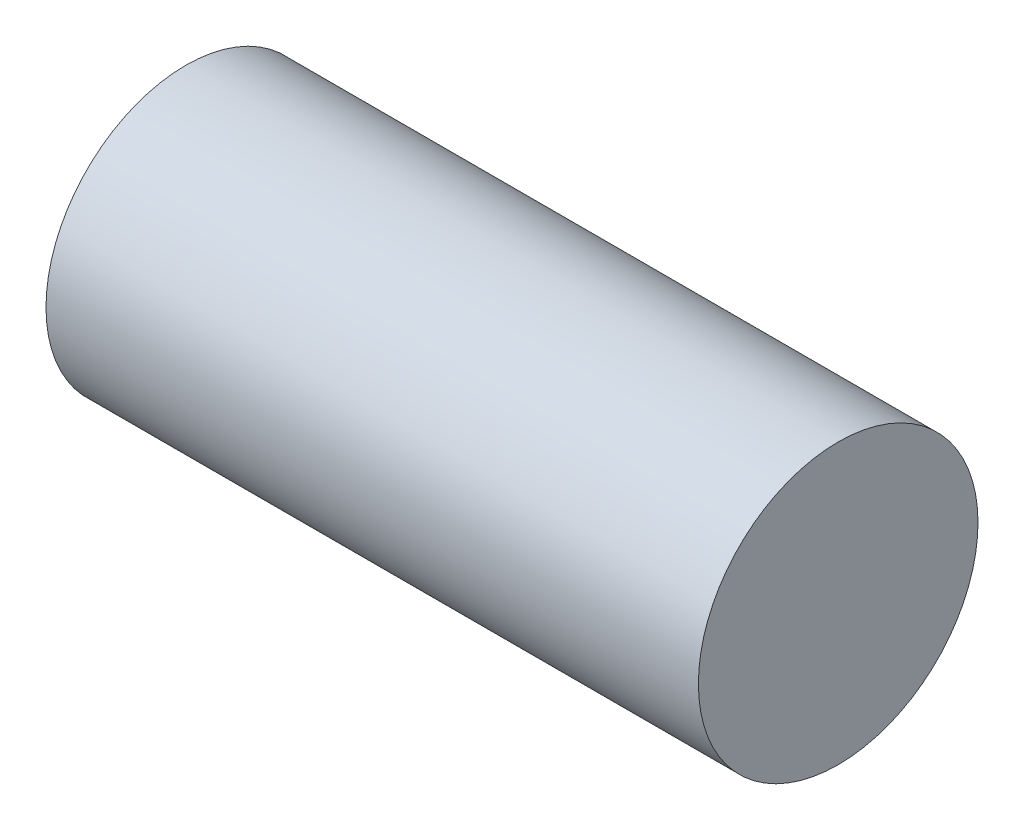
ISO-10303-21;
HEADER;
FILE_DESCRIPTION(('STEP AP214'),'2;1');
FILE_NAME('part.step','',(''),(''),'','','');
FILE_SCHEMA(('AUTOMOTIVE_DESIGN { 1 0 10303 214 1 1 1 1 }'));
ENDSEC;
DATA;
#1=APPLICATION_CONTEXT('core data for automotive mechanical design processes');
#2=APPLICATION_PROTOCOL_DEFINITION('international standard','automotive_design',2000,#1);
#3=PRODUCT_CONTEXT('',#1,'mechanical');
#4=PRODUCT('Part','Part','',(#3));
#5=PRODUCT_RELATED_PRODUCT_CATEGORY('part','',(#4));
#6=PRODUCT_DEFINITION_FORMATION('','',#4);
#7=PRODUCT_DEFINITION_CONTEXT('part definition',#1,'design');
#8=PRODUCT_DEFINITION('design','',#6,#7);
#9=PRODUCT_DEFINITION_SHAPE('','',#8);
#10=(LENGTH_UNIT() NAMED_UNIT(*) SI_UNIT(.MILLI.,.METRE.));
#11=(NAMED_UNIT(*) PLANE_ANGLE_UNIT() SI_UNIT($,.RADIAN.));
#12=(NAMED_UNIT(*) SI_UNIT($,.STERADIAN.) SOLID_ANGLE_UNIT());
#13=UNCERTAINTY_MEASURE_WITH_UNIT(LENGTH_MEASURE(1.E-05),#10,'distance_accuracy_value','');
#14=(GEOMETRIC_REPRESENTATION_CONTEXT(3) GLOBAL_UNCERTAINTY_ASSIGNED_CONTEXT((#13)) GLOBAL_UNIT_ASSIGNED_CONTEXT((#10,
#11,#12)) REPRESENTATION_CONTEXT('',''));
#15=CARTESIAN_POINT('',(0.,0.,0.));
#16=DIRECTION('',(0.,0.,1.));
#17=DIRECTION('',(1.,0.,0.));
#18=AXIS2_PLACEMENT_3D('',#15,#16,#17);
#19=CARTESIAN_POINT('',(341.376,0.,0.));
#20=DIRECTION('',(-1.,0.,0.));
#21=DIRECTION('',(0.,0.,1.));
#22=AXIS2_PLACEMENT_3D('',#19,#20,#21);
#23=CYLINDRICAL_SURFACE('',#22,108.204);
#24=CARTESIAN_POINT('',(341.376,0.,0.));
#25=DIRECTION('',(1.,0.,0.));
#26=DIRECTION('',(0.,0.,-1.));
#27=AXIS2_PLACEMENT_3D('',#24,#25,#26);
#28=CIRCLE('',#27,108.204);
#29=CARTESIAN_POINT('',(341.376,0.,-108.204));
#30=VERTEX_POINT('',#29);
#31=EDGE_CURVE('E10',#30,#30,#28,.T.);
#32=ORIENTED_EDGE('',*,*,#31,.F.);
#33=EDGE_LOOP('',(#32));
#34=FACE_BOUND('',#33,.T.);
#35=CARTESIAN_POINT('',(-163.576,0.,0.));
#36=DIRECTION('',(1.,0.,0.));
#37=DIRECTION('',(0.,0.,-1.));
#38=AXIS2_PLACEMENT_3D('',#35,#36,#37);
#39=CIRCLE('',#38,108.204);
#40=CARTESIAN_POINT('',(-163.576,0.,-108.204));
#41=VERTEX_POINT('',#40);
#42=EDGE_CURVE('E40',#41,#41,#39,.T.);
#43=ORIENTED_EDGE('',*,*,#42,.T.);
#44=EDGE_LOOP('',(#43));
#45=FACE_BOUND('',#44,.T.);
#46=ADVANCED_FACE('F37',(#34,#45),#23,.T.);
#47=CARTESIAN_POINT('',(341.376,0.,0.));
#48=DIRECTION('',(1.,0.,0.));
#49=DIRECTION('',(0.,0.,-1.));
#50=AXIS2_PLACEMENT_3D('',#47,#48,#49);
#51=PLANE('',#50);
#52=ORIENTED_EDGE('',*,*,#31,.T.);
#53=EDGE_LOOP('',(#52));
#54=FACE_BOUND('',#53,.T.);
#55=ADVANCED_FACE('F52',(#54),#51,.T.);
#56=CARTESIAN_POINT('',(-163.576,0.,0.));
#57=DIRECTION('',(1.,0.,0.));
#58=DIRECTION('',(0.,0.,-1.));
#59=AXIS2_PLACEMENT_3D('',#56,#57,#58);
#60=PLANE('',#59);
#61=ORIENTED_EDGE('',*,*,#42,.F.);
#62=EDGE_LOOP('',(#61));
#63=FACE_BOUND('',#62,.T.);
#64=ADVANCED_FACE('F50',(#63),#60,.F.);
#65=CLOSED_SHELL('',(#46,#55,#64));
#66=MANIFOLD_SOLID_BREP('B2',#65);
#67=ADVANCED_BREP_SHAPE_REPRESENTATION('',(#18,#66),#14);
#68=SHAPE_DEFINITION_REPRESENTATION(#9,#67);
ENDSEC;
END-ISO-10303-21;
